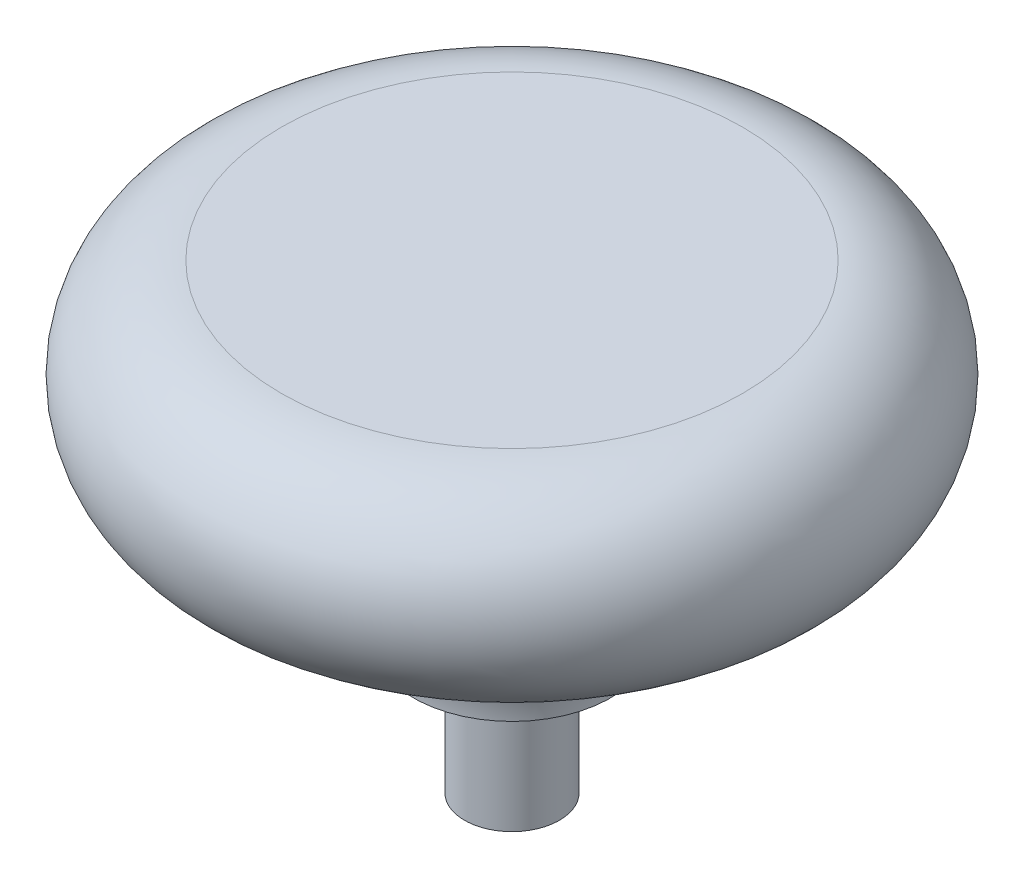
ISO-10303-21;
HEADER;
FILE_DESCRIPTION(('STEP AP214'),'2;1');
FILE_NAME('part.step','',(''),(''),'','','');
FILE_SCHEMA(('AUTOMOTIVE_DESIGN { 1 0 10303 214 1 1 1 1 }'));
ENDSEC;
DATA;
#1=APPLICATION_CONTEXT('core data for automotive mechanical design processes');
#2=APPLICATION_PROTOCOL_DEFINITION('international standard','automotive_design',2000,#1);
#3=PRODUCT_CONTEXT('',#1,'mechanical');
#4=PRODUCT('Part','Part','',(#3));
#5=PRODUCT_RELATED_PRODUCT_CATEGORY('part','',(#4));
#6=PRODUCT_DEFINITION_FORMATION('','',#4);
#7=PRODUCT_DEFINITION_CONTEXT('part definition',#1,'design');
#8=PRODUCT_DEFINITION('design','',#6,#7);
#9=PRODUCT_DEFINITION_SHAPE('','',#8);
#10=(LENGTH_UNIT() NAMED_UNIT(*) SI_UNIT(.MILLI.,.METRE.));
#11=(NAMED_UNIT(*) PLANE_ANGLE_UNIT() SI_UNIT($,.RADIAN.));
#12=(NAMED_UNIT(*) SI_UNIT($,.STERADIAN.) SOLID_ANGLE_UNIT());
#13=UNCERTAINTY_MEASURE_WITH_UNIT(LENGTH_MEASURE(1.E-05),#10,'distance_accuracy_value','');
#14=(GEOMETRIC_REPRESENTATION_CONTEXT(3) GLOBAL_UNCERTAINTY_ASSIGNED_CONTEXT((#13)) GLOBAL_UNIT_ASSIGNED_CONTEXT((#10,
#11,#12)) REPRESENTATION_CONTEXT('',''));
#15=CARTESIAN_POINT('',(0.,0.,0.));
#16=DIRECTION('',(0.,0.,1.));
#17=DIRECTION('',(1.,0.,0.));
#18=AXIS2_PLACEMENT_3D('',#15,#16,#17);
#19=CARTESIAN_POINT('',(2.286,0.,0.));
#20=DIRECTION('',(0.,1.,0.));
#21=DIRECTION('',(0.,0.,1.));
#22=AXIS2_PLACEMENT_3D('',#19,#20,#21);
#23=PLANE('',#22);
#24=CARTESIAN_POINT('',(0.,0.,0.));
#25=DIRECTION('',(0.,-1.,0.));
#26=DIRECTION('',(0.,0.,-1.));
#27=AXIS2_PLACEMENT_3D('',#24,#25,#26);
#28=CIRCLE('',#27,2.286);
#29=CARTESIAN_POINT('',(0.,0.,-2.286));
#30=VERTEX_POINT('',#29);
#31=EDGE_CURVE('E51',#30,#30,#28,.T.);
#32=ORIENTED_EDGE('',*,*,#31,.T.);
#33=EDGE_LOOP('',(#32));
#34=FACE_BOUND('',#33,.T.);
#35=ADVANCED_FACE('F32',(#34),#23,.F.);
#36=CARTESIAN_POINT('',(0.,22.225,0.));
#37=DIRECTION('',(0.,-1.,0.));
#38=DIRECTION('',(0.,0.,-1.));
#39=AXIS2_PLACEMENT_3D('',#36,#37,#38);
#40=PLANE('',#39);
#41=CARTESIAN_POINT('',(0.,22.225,0.));
#42=DIRECTION('',(0.,-1.,0.));
#43=DIRECTION('',(0.,0.,-1.));
#44=AXIS2_PLACEMENT_3D('',#41,#42,#43);
#45=CIRCLE('',#44,11.1125);
#46=CARTESIAN_POINT('',(0.,22.225,-11.1125));
#47=VERTEX_POINT('',#46);
#48=EDGE_CURVE('E10',#47,#47,#45,.T.);
#49=ORIENTED_EDGE('',*,*,#48,.F.);
#50=EDGE_LOOP('',(#49));
#51=FACE_BOUND('',#50,.T.);
#52=ADVANCED_FACE('F75',(#51),#40,.F.);
#53=CARTESIAN_POINT('',(0.,17.4625,0.));
#54=DIRECTION('',(0.,-1.,0.));
#55=DIRECTION('',(0.,0.,-1.));
#56=AXIS2_PLACEMENT_3D('',#53,#54,#55);
#57=TOROIDAL_SURFACE('',#56,11.1125,4.7625);
#58=CARTESIAN_POINT('',(0.,12.7,0.));
#59=DIRECTION('',(0.,-1.,0.));
#60=DIRECTION('',(0.,0.,-1.));
#61=AXIS2_PLACEMENT_3D('',#58,#59,#60);
#62=CIRCLE('',#61,11.1125);
#63=CARTESIAN_POINT('',(0.,12.7,-11.1125));
#64=VERTEX_POINT('',#63);
#65=EDGE_CURVE('E38',#64,#64,#62,.T.);
#66=ORIENTED_EDGE('',*,*,#65,.F.);
#67=EDGE_LOOP('',(#66));
#68=FACE_BOUND('',#67,.T.);
#69=ORIENTED_EDGE('',*,*,#48,.T.);
#70=EDGE_LOOP('',(#69));
#71=FACE_BOUND('',#70,.T.);
#72=ADVANCED_FACE('F70',(#68,#71),#57,.T.);
#73=CARTESIAN_POINT('',(0.,6.35,0.));
#74=DIRECTION('',(0.,-1.,0.));
#75=DIRECTION('',(0.,0.,-1.));
#76=AXIS2_PLACEMENT_3D('',#73,#74,#75);
#77=TOROIDAL_SURFACE('',#76,11.1125,6.35);
#78=CARTESIAN_POINT('',(0.,6.35,0.));
#79=DIRECTION('',(0.,-1.,0.));
#80=DIRECTION('',(0.,0.,-1.));
#81=AXIS2_PLACEMENT_3D('',#78,#79,#80);
#82=CIRCLE('',#81,4.7625);
#83=CARTESIAN_POINT('',(0.,6.35,-4.7625));
#84=VERTEX_POINT('',#83);
#85=EDGE_CURVE('E42',#84,#84,#82,.T.);
#86=ORIENTED_EDGE('',*,*,#85,.F.);
#87=EDGE_LOOP('',(#86));
#88=FACE_BOUND('',#87,.T.);
#89=ORIENTED_EDGE('',*,*,#65,.T.);
#90=EDGE_LOOP('',(#89));
#91=FACE_BOUND('',#90,.T.);
#92=ADVANCED_FACE('F65',(#88,#91),#77,.F.);
#93=CARTESIAN_POINT('',(4.7625,6.35,0.));
#94=DIRECTION('',(0.,1.,0.));
#95=DIRECTION('',(0.,0.,1.));
#96=AXIS2_PLACEMENT_3D('',#93,#94,#95);
#97=PLANE('',#96);
#98=CARTESIAN_POINT('',(0.,6.35,0.));
#99=DIRECTION('',(0.,-1.,0.));
#100=DIRECTION('',(0.,0.,-1.));
#101=AXIS2_PLACEMENT_3D('',#98,#99,#100);
#102=CIRCLE('',#101,2.286);
#103=CARTESIAN_POINT('',(0.,6.35,-2.286));
#104=VERTEX_POINT('',#103);
#105=EDGE_CURVE('E46',#104,#104,#102,.T.);
#106=ORIENTED_EDGE('',*,*,#105,.F.);
#107=EDGE_LOOP('',(#106));
#108=FACE_BOUND('',#107,.T.);
#109=ORIENTED_EDGE('',*,*,#85,.T.);
#110=EDGE_LOOP('',(#109));
#111=FACE_BOUND('',#110,.T.);
#112=ADVANCED_FACE('F59',(#108,#111),#97,.F.);
#113=CARTESIAN_POINT('',(0.,0.,0.));
#114=DIRECTION('',(0.,-1.,0.));
#115=DIRECTION('',(0.,0.,-1.));
#116=AXIS2_PLACEMENT_3D('',#113,#114,#115);
#117=CYLINDRICAL_SURFACE('',#116,2.286);
#118=ORIENTED_EDGE('',*,*,#31,.F.);
#119=EDGE_LOOP('',(#118));
#120=FACE_BOUND('',#119,.T.);
#121=ORIENTED_EDGE('',*,*,#105,.T.);
#122=EDGE_LOOP('',(#121));
#123=FACE_BOUND('',#122,.T.);
#124=ADVANCED_FACE('F56',(#120,#123),#117,.T.);
#125=CLOSED_SHELL('',(#35,#52,#72,#92,#112,#124));
#126=MANIFOLD_SOLID_BREP('B2',#125);
#127=ADVANCED_BREP_SHAPE_REPRESENTATION('',(#18,#126),#14);
#128=SHAPE_DEFINITION_REPRESENTATION(#9,#127);
ENDSEC;
END-ISO-10303-21;
